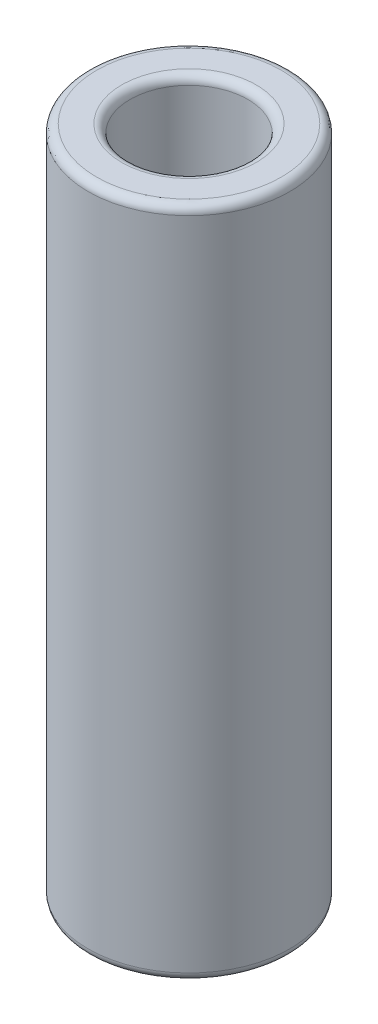
ISO-10303-21;
HEADER;
FILE_DESCRIPTION(('STEP AP214'),'2;1');
FILE_NAME('part.step','',(''),(''),'','','');
FILE_SCHEMA(('AUTOMOTIVE_DESIGN { 1 0 10303 214 1 1 1 1 }'));
ENDSEC;
DATA;
#1=APPLICATION_CONTEXT('core data for automotive mechanical design processes');
#2=APPLICATION_PROTOCOL_DEFINITION('international standard','automotive_design',2000,#1);
#3=PRODUCT_CONTEXT('',#1,'mechanical');
#4=PRODUCT('Part','Part','',(#3));
#5=PRODUCT_RELATED_PRODUCT_CATEGORY('part','',(#4));
#6=PRODUCT_DEFINITION_FORMATION('','',#4);
#7=PRODUCT_DEFINITION_CONTEXT('part definition',#1,'design');
#8=PRODUCT_DEFINITION('design','',#6,#7);
#9=PRODUCT_DEFINITION_SHAPE('','',#8);
#10=(LENGTH_UNIT() NAMED_UNIT(*) SI_UNIT(.MILLI.,.METRE.));
#11=(NAMED_UNIT(*) PLANE_ANGLE_UNIT() SI_UNIT($,.RADIAN.));
#12=(NAMED_UNIT(*) SI_UNIT($,.STERADIAN.) SOLID_ANGLE_UNIT());
#13=UNCERTAINTY_MEASURE_WITH_UNIT(LENGTH_MEASURE(1.E-05),#10,'distance_accuracy_value','');
#14=(GEOMETRIC_REPRESENTATION_CONTEXT(3) GLOBAL_UNCERTAINTY_ASSIGNED_CONTEXT((#13)) GLOBAL_UNIT_ASSIGNED_CONTEXT((#10,
#11,#12)) REPRESENTATION_CONTEXT('',''));
#15=CARTESIAN_POINT('',(0.,0.,0.));
#16=DIRECTION('',(0.,0.,1.));
#17=DIRECTION('',(1.,0.,0.));
#18=AXIS2_PLACEMENT_3D('',#15,#16,#17);
#19=CARTESIAN_POINT('',(0.,40.,0.));
#20=DIRECTION('',(0.,1.,0.));
#21=DIRECTION('',(0.,0.,1.));
#22=AXIS2_PLACEMENT_3D('',#19,#20,#21);
#23=PLANE('',#22);
#24=CARTESIAN_POINT('',(0.,40.,0.));
#25=DIRECTION('',(0.,1.,0.));
#26=DIRECTION('',(0.,0.,1.));
#27=AXIS2_PLACEMENT_3D('',#24,#25,#26);
#28=CIRCLE('',#27,4.);
#29=CARTESIAN_POINT('',(0.,40.,4.));
#30=VERTEX_POINT('',#29);
#31=EDGE_CURVE('E60',#30,#30,#28,.F.);
#32=ORIENTED_EDGE('',*,*,#31,.T.);
#33=EDGE_LOOP('',(#32));
#34=FACE_BOUND('',#33,.T.);
#35=CARTESIAN_POINT('',(0.,40.,0.));
#36=DIRECTION('',(0.,1.,0.));
#37=DIRECTION('',(0.,0.,1.));
#38=AXIS2_PLACEMENT_3D('',#35,#36,#37);
#39=CIRCLE('',#38,5.5);
#40=CARTESIAN_POINT('',(0.,40.,5.5));
#41=VERTEX_POINT('',#40);
#42=EDGE_CURVE('E63',#41,#41,#39,.T.);
#43=ORIENTED_EDGE('',*,*,#42,.T.);
#44=EDGE_LOOP('',(#43));
#45=FACE_BOUND('',#44,.T.);
#46=ADVANCED_FACE('F37',(#34,#45),#23,.T.);
#47=CARTESIAN_POINT('',(0.,0.,0.));
#48=DIRECTION('',(0.,1.,0.));
#49=DIRECTION('',(0.,0.,1.));
#50=AXIS2_PLACEMENT_3D('',#47,#48,#49);
#51=PLANE('',#50);
#52=CARTESIAN_POINT('',(0.,0.,0.));
#53=DIRECTION('',(0.,1.,0.));
#54=DIRECTION('',(0.,0.,1.));
#55=AXIS2_PLACEMENT_3D('',#52,#53,#54);
#56=CIRCLE('',#55,4.);
#57=CARTESIAN_POINT('',(0.,0.,4.));
#58=VERTEX_POINT('',#57);
#59=EDGE_CURVE('E48',#58,#58,#56,.T.);
#60=ORIENTED_EDGE('',*,*,#59,.T.);
#61=EDGE_LOOP('',(#60));
#62=FACE_BOUND('',#61,.T.);
#63=CARTESIAN_POINT('',(0.,0.,0.));
#64=DIRECTION('',(0.,1.,0.));
#65=DIRECTION('',(0.,0.,1.));
#66=AXIS2_PLACEMENT_3D('',#63,#64,#65);
#67=CIRCLE('',#66,5.5);
#68=CARTESIAN_POINT('',(0.,0.,5.5));
#69=VERTEX_POINT('',#68);
#70=EDGE_CURVE('E52',#69,#69,#67,.F.);
#71=ORIENTED_EDGE('',*,*,#70,.T.);
#72=EDGE_LOOP('',(#71));
#73=FACE_BOUND('',#72,.T.);
#74=ADVANCED_FACE('F89',(#62,#73),#51,.F.);
#75=CARTESIAN_POINT('',(0.,40.,0.));
#76=DIRECTION('',(0.,-1.,0.));
#77=DIRECTION('',(0.,0.,-1.));
#78=AXIS2_PLACEMENT_3D('',#75,#76,#77);
#79=CYLINDRICAL_SURFACE('',#78,6.);
#80=CARTESIAN_POINT('',(0.,0.5,0.));
#81=DIRECTION('',(0.,1.,0.));
#82=DIRECTION('',(0.,0.,1.));
#83=AXIS2_PLACEMENT_3D('',#80,#81,#82);
#84=CIRCLE('',#83,6.);
#85=CARTESIAN_POINT('',(0.,0.5,6.));
#86=VERTEX_POINT('',#85);
#87=EDGE_CURVE('E11',#86,#86,#84,.T.);
#88=ORIENTED_EDGE('',*,*,#87,.T.);
#89=EDGE_LOOP('',(#88));
#90=FACE_BOUND('',#89,.T.);
#91=CARTESIAN_POINT('',(0.,39.5,0.));
#92=DIRECTION('',(0.,1.,0.));
#93=DIRECTION('',(0.,0.,1.));
#94=AXIS2_PLACEMENT_3D('',#91,#92,#93);
#95=CIRCLE('',#94,6.);
#96=CARTESIAN_POINT('',(0.,39.5,6.));
#97=VERTEX_POINT('',#96);
#98=EDGE_CURVE('E57',#97,#97,#95,.F.);
#99=ORIENTED_EDGE('',*,*,#98,.T.);
#100=EDGE_LOOP('',(#99));
#101=FACE_BOUND('',#100,.T.);
#102=ADVANCED_FACE('F84',(#90,#101),#79,.T.);
#103=CARTESIAN_POINT('',(0.,40.,0.));
#104=DIRECTION('',(0.,-1.,0.));
#105=DIRECTION('',(0.,0.,-1.));
#106=AXIS2_PLACEMENT_3D('',#103,#104,#105);
#107=CYLINDRICAL_SURFACE('',#106,3.5);
#108=CARTESIAN_POINT('',(0.,0.5,0.));
#109=DIRECTION('',(0.,1.,0.));
#110=DIRECTION('',(0.,0.,1.));
#111=AXIS2_PLACEMENT_3D('',#108,#109,#110);
#112=CIRCLE('',#111,3.5);
#113=CARTESIAN_POINT('',(0.,0.5,3.5));
#114=VERTEX_POINT('',#113);
#115=EDGE_CURVE('E44',#114,#114,#112,.F.);
#116=ORIENTED_EDGE('',*,*,#115,.T.);
#117=EDGE_LOOP('',(#116));
#118=FACE_BOUND('',#117,.T.);
#119=CARTESIAN_POINT('',(0.,39.5,0.));
#120=DIRECTION('',(0.,1.,0.));
#121=DIRECTION('',(0.,0.,1.));
#122=AXIS2_PLACEMENT_3D('',#119,#120,#121);
#123=CIRCLE('',#122,3.5);
#124=CARTESIAN_POINT('',(0.,39.5,3.5));
#125=VERTEX_POINT('',#124);
#126=EDGE_CURVE('E66',#125,#125,#123,.T.);
#127=ORIENTED_EDGE('',*,*,#126,.T.);
#128=EDGE_LOOP('',(#127));
#129=FACE_BOUND('',#128,.T.);
#130=ADVANCED_FACE('F70',(#118,#129),#107,.F.);
#131=CARTESIAN_POINT('',(0.,39.5,0.));
#132=DIRECTION('',(0.,1.,0.));
#133=DIRECTION('',(0.,0.,1.));
#134=AXIS2_PLACEMENT_3D('',#131,#132,#133);
#135=TOROIDAL_SURFACE('',#134,4.,0.5);
#136=ORIENTED_EDGE('',*,*,#31,.F.);
#137=EDGE_LOOP('',(#136));
#138=FACE_BOUND('',#137,.T.);
#139=ORIENTED_EDGE('',*,*,#126,.F.);
#140=EDGE_LOOP('',(#139));
#141=FACE_BOUND('',#140,.T.);
#142=ADVANCED_FACE('F72',(#138,#141),#135,.T.);
#143=CARTESIAN_POINT('',(0.,39.5,0.));
#144=DIRECTION('',(0.,1.,0.));
#145=DIRECTION('',(0.,0.,1.));
#146=AXIS2_PLACEMENT_3D('',#143,#144,#145);
#147=TOROIDAL_SURFACE('',#146,5.5,0.5);
#148=ORIENTED_EDGE('',*,*,#98,.F.);
#149=EDGE_LOOP('',(#148));
#150=FACE_BOUND('',#149,.T.);
#151=ORIENTED_EDGE('',*,*,#42,.F.);
#152=EDGE_LOOP('',(#151));
#153=FACE_BOUND('',#152,.T.);
#154=ADVANCED_FACE('F74',(#150,#153),#147,.T.);
#155=CARTESIAN_POINT('',(0.,0.5,0.));
#156=DIRECTION('',(0.,1.,0.));
#157=DIRECTION('',(0.,0.,1.));
#158=AXIS2_PLACEMENT_3D('',#155,#156,#157);
#159=TOROIDAL_SURFACE('',#158,4.,0.5);
#160=ORIENTED_EDGE('',*,*,#115,.F.);
#161=EDGE_LOOP('',(#160));
#162=FACE_BOUND('',#161,.T.);
#163=ORIENTED_EDGE('',*,*,#59,.F.);
#164=EDGE_LOOP('',(#163));
#165=FACE_BOUND('',#164,.T.);
#166=ADVANCED_FACE('F81',(#162,#165),#159,.T.);
#167=CARTESIAN_POINT('',(0.,0.5,0.));
#168=DIRECTION('',(0.,1.,0.));
#169=DIRECTION('',(0.,0.,1.));
#170=AXIS2_PLACEMENT_3D('',#167,#168,#169);
#171=TOROIDAL_SURFACE('',#170,5.5,0.5);
#172=ORIENTED_EDGE('',*,*,#70,.F.);
#173=EDGE_LOOP('',(#172));
#174=FACE_BOUND('',#173,.T.);
#175=ORIENTED_EDGE('',*,*,#87,.F.);
#176=EDGE_LOOP('',(#175));
#177=FACE_BOUND('',#176,.T.);
#178=ADVANCED_FACE('F39',(#174,#177),#171,.T.);
#179=CLOSED_SHELL('',(#46,#74,#102,#130,#142,#154,#166,#178));
#180=MANIFOLD_SOLID_BREP('B2',#179);
#181=ADVANCED_BREP_SHAPE_REPRESENTATION('',(#18,#180),#14);
#182=SHAPE_DEFINITION_REPRESENTATION(#9,#181);
ENDSEC;
END-ISO-10303-21;
